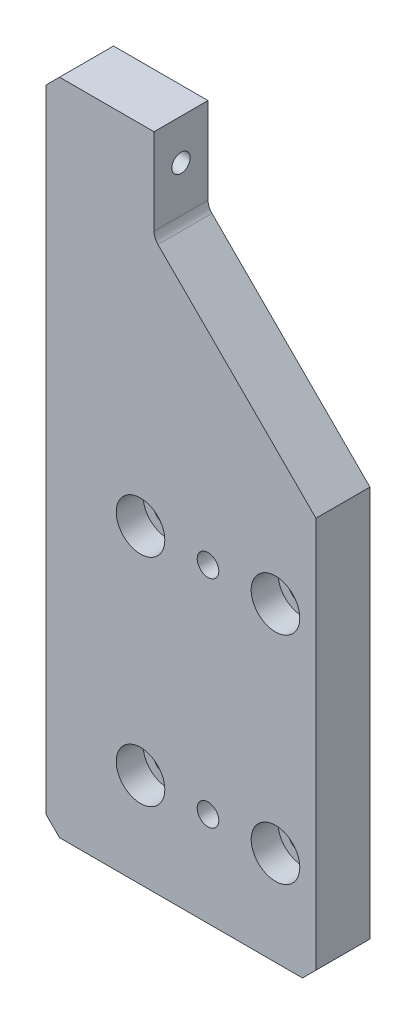
ISO-10303-21;
HEADER;
FILE_DESCRIPTION(('STEP AP214'),'2;1');
FILE_NAME('part.step','',(''),(''),'','','');
FILE_SCHEMA(('AUTOMOTIVE_DESIGN { 1 0 10303 214 1 1 1 1 }'));
ENDSEC;
DATA;
#1=APPLICATION_CONTEXT('core data for automotive mechanical design processes');
#2=APPLICATION_PROTOCOL_DEFINITION('international standard','automotive_design',2000,#1);
#3=PRODUCT_CONTEXT('',#1,'mechanical');
#4=PRODUCT('Part','Part','',(#3));
#5=PRODUCT_RELATED_PRODUCT_CATEGORY('part','',(#4));
#6=PRODUCT_DEFINITION_FORMATION('','',#4);
#7=PRODUCT_DEFINITION_CONTEXT('part definition',#1,'design');
#8=PRODUCT_DEFINITION('design','',#6,#7);
#9=PRODUCT_DEFINITION_SHAPE('','',#8);
#10=(LENGTH_UNIT() NAMED_UNIT(*) SI_UNIT(.MILLI.,.METRE.));
#11=(NAMED_UNIT(*) PLANE_ANGLE_UNIT() SI_UNIT($,.RADIAN.));
#12=(NAMED_UNIT(*) SI_UNIT($,.STERADIAN.) SOLID_ANGLE_UNIT());
#13=UNCERTAINTY_MEASURE_WITH_UNIT(LENGTH_MEASURE(1.E-05),#10,'distance_accuracy_value','');
#14=(GEOMETRIC_REPRESENTATION_CONTEXT(3) GLOBAL_UNCERTAINTY_ASSIGNED_CONTEXT((#13)) GLOBAL_UNIT_ASSIGNED_CONTEXT((#10,
#11,#12)) REPRESENTATION_CONTEXT('',''));
#15=CARTESIAN_POINT('',(0.,0.,0.));
#16=DIRECTION('',(0.,0.,1.));
#17=DIRECTION('',(1.,0.,0.));
#18=AXIS2_PLACEMENT_3D('',#15,#16,#17);
#19=CARTESIAN_POINT('',(50.,0.,20.));
#20=DIRECTION('',(0.,0.,-1.));
#21=DIRECTION('',(-1.,0.,0.));
#22=AXIS2_PLACEMENT_3D('',#19,#20,#21);
#23=PLANE('',#22);
#24=CARTESIAN_POINT('',(10.,-209.,20.));
#25=DIRECTION('',(0.,0.,1.));
#26=DIRECTION('',(1.,0.,0.));
#27=AXIS2_PLACEMENT_3D('',#24,#25,#26);
#28=CIRCLE('',#27,3.99999999999999);
#29=CARTESIAN_POINT('',(14.,-209.,20.));
#30=VERTEX_POINT('',#29);
#31=EDGE_CURVE('E256',#30,#30,#28,.T.);
#32=ORIENTED_EDGE('',*,*,#31,.F.);
#33=EDGE_LOOP('',(#32));
#34=FACE_BOUND('',#33,.T.);
#35=CARTESIAN_POINT('',(35.,-129.,20.));
#36=DIRECTION('',(0.,0.,1.));
#37=DIRECTION('',(1.,0.,0.));
#38=AXIS2_PLACEMENT_3D('',#35,#36,#37);
#39=CIRCLE('',#38,9.);
#40=CARTESIAN_POINT('',(44.,-129.,20.));
#41=VERTEX_POINT('',#40);
#42=EDGE_CURVE('E210',#41,#41,#39,.T.);
#43=ORIENTED_EDGE('',*,*,#42,.F.);
#44=EDGE_LOOP('',(#43));
#45=FACE_BOUND('',#44,.T.);
#46=DIRECTION('',(-1.,0.,0.));
#47=VECTOR('',#46,1.);
#48=CARTESIAN_POINT('',(50.,0.,20.));
#49=LINE('',#48,#47);
#50=CARTESIAN_POINT('',(-9.99999999999999,0.,20.));
#51=VERTEX_POINT('',#50);
#52=CARTESIAN_POINT('',(-44.9999999999999,0.,20.));
#53=VERTEX_POINT('',#52);
#54=EDGE_CURVE('E131',#51,#53,#49,.T.);
#55=ORIENTED_EDGE('',*,*,#54,.T.);
#56=DIRECTION('',(0.707106781186546,0.70710678118655,0.));
#57=VECTOR('',#56,1.);
#58=CARTESIAN_POINT('',(-45.,0.,20.));
#59=LINE('',#58,#57);
#60=CARTESIAN_POINT('',(-50.,-5.00000000000003,20.));
#61=VERTEX_POINT('',#60);
#62=EDGE_CURVE('E172',#53,#61,#59,.F.);
#63=ORIENTED_EDGE('',*,*,#62,.T.);
#64=DIRECTION('',(0.,-1.,0.));
#65=VECTOR('',#64,1.);
#66=CARTESIAN_POINT('',(-50.,0.,20.));
#67=LINE('',#66,#65);
#68=CARTESIAN_POINT('',(-50.,-239.,20.));
#69=VERTEX_POINT('',#68);
#70=EDGE_CURVE('E293',#61,#69,#67,.T.);
#71=ORIENTED_EDGE('',*,*,#70,.T.);
#72=DIRECTION('',(-0.707106781186546,0.70710678118655,0.));
#73=VECTOR('',#72,1.);
#74=CARTESIAN_POINT('',(-45.,-244.,20.));
#75=LINE('',#74,#73);
#76=CARTESIAN_POINT('',(-44.9999999999999,-244.,20.));
#77=VERTEX_POINT('',#76);
#78=EDGE_CURVE('E167',#69,#77,#75,.F.);
#79=ORIENTED_EDGE('',*,*,#78,.T.);
#80=DIRECTION('',(-1.,0.,0.));
#81=VECTOR('',#80,1.);
#82=CARTESIAN_POINT('',(50.,-244.,20.));
#83=LINE('',#82,#81);
#84=CARTESIAN_POINT('',(45.,-244.,20.));
#85=VERTEX_POINT('',#84);
#86=EDGE_CURVE('E145',#85,#77,#83,.T.);
#87=ORIENTED_EDGE('',*,*,#86,.F.);
#88=DIRECTION('',(0.70710678118655,0.707106781186546,0.));
#89=VECTOR('',#88,1.);
#90=CARTESIAN_POINT('',(50.,-239.,20.));
#91=LINE('',#90,#89);
#92=CARTESIAN_POINT('',(50.,-239.,20.));
#93=VERTEX_POINT('',#92);
#94=EDGE_CURVE('E170',#85,#93,#91,.T.);
#95=ORIENTED_EDGE('',*,*,#94,.T.);
#96=DIRECTION('',(0.,-1.,0.));
#97=VECTOR('',#96,1.);
#98=CARTESIAN_POINT('',(50.,0.,20.));
#99=LINE('',#98,#97);
#100=CARTESIAN_POINT('',(50.,-94.0000000000002,20.));
#101=VERTEX_POINT('',#100);
#102=EDGE_CURVE('E246',#101,#93,#99,.T.);
#103=ORIENTED_EDGE('',*,*,#102,.F.);
#104=DIRECTION('',(-0.707106781186546,0.707106781186549,0.));
#105=VECTOR('',#104,1.);
#106=CARTESIAN_POINT('',(-9.99999999999999,-34.,20.));
#107=LINE('',#106,#105);
#108=CARTESIAN_POINT('',(-8.53553390593274,-35.4644660940673,20.));
#109=VERTEX_POINT('',#108);
#110=EDGE_CURVE('E161',#101,#109,#107,.T.);
#111=ORIENTED_EDGE('',*,*,#110,.T.);
#112=CARTESIAN_POINT('',(-4.99999999999999,-31.9289321881345,20.));
#113=DIRECTION('',(0.,0.,-1.));
#114=DIRECTION('',(-1.,0.,0.));
#115=AXIS2_PLACEMENT_3D('',#112,#113,#114);
#116=CIRCLE('',#115,5.);
#117=CARTESIAN_POINT('',(-9.99999999999999,-31.9289321881345,20.));
#118=VERTEX_POINT('',#117);
#119=EDGE_CURVE('E47',#109,#118,#116,.T.);
#120=ORIENTED_EDGE('',*,*,#119,.T.);
#121=DIRECTION('',(0.,1.,0.));
#122=VECTOR('',#121,1.);
#123=CARTESIAN_POINT('',(-9.99999999999999,-34.,20.));
#124=LINE('',#123,#122);
#125=EDGE_CURVE('E122',#118,#51,#124,.T.);
#126=ORIENTED_EDGE('',*,*,#125,.T.);
#127=EDGE_LOOP('',(#55,#63,#71,#79,#87,#95,#103,#111,#120,#126));
#128=FACE_BOUND('',#127,.T.);
#129=CARTESIAN_POINT('',(35.,-209.,20.));
#130=DIRECTION('',(0.,0.,1.));
#131=DIRECTION('',(1.,0.,0.));
#132=AXIS2_PLACEMENT_3D('',#129,#130,#131);
#133=CIRCLE('',#132,9.);
#134=CARTESIAN_POINT('',(44.,-209.,20.));
#135=VERTEX_POINT('',#134);
#136=EDGE_CURVE('E233',#135,#135,#133,.T.);
#137=ORIENTED_EDGE('',*,*,#136,.F.);
#138=EDGE_LOOP('',(#137));
#139=FACE_BOUND('',#138,.T.);
#140=CARTESIAN_POINT('',(-15.,-209.,20.));
#141=DIRECTION('',(0.,0.,1.));
#142=DIRECTION('',(1.,0.,0.));
#143=AXIS2_PLACEMENT_3D('',#140,#141,#142);
#144=CIRCLE('',#143,9.);
#145=CARTESIAN_POINT('',(-6.,-209.,20.));
#146=VERTEX_POINT('',#145);
#147=EDGE_CURVE('E251',#146,#146,#144,.T.);
#148=ORIENTED_EDGE('',*,*,#147,.F.);
#149=EDGE_LOOP('',(#148));
#150=FACE_BOUND('',#149,.T.);
#151=CARTESIAN_POINT('',(-15.,-129.,20.));
#152=DIRECTION('',(0.,0.,1.));
#153=DIRECTION('',(1.,0.,0.));
#154=AXIS2_PLACEMENT_3D('',#151,#152,#153);
#155=CIRCLE('',#154,9.);
#156=CARTESIAN_POINT('',(-6.,-129.,20.));
#157=VERTEX_POINT('',#156);
#158=EDGE_CURVE('E230',#157,#157,#155,.T.);
#159=ORIENTED_EDGE('',*,*,#158,.F.);
#160=EDGE_LOOP('',(#159));
#161=FACE_BOUND('',#160,.T.);
#162=CARTESIAN_POINT('',(10.,-129.,20.));
#163=DIRECTION('',(0.,0.,1.));
#164=DIRECTION('',(1.,0.,0.));
#165=AXIS2_PLACEMENT_3D('',#162,#163,#164);
#166=CIRCLE('',#165,3.99999999999999);
#167=CARTESIAN_POINT('',(14.,-129.,20.));
#168=VERTEX_POINT('',#167);
#169=EDGE_CURVE('E208',#168,#168,#166,.T.);
#170=ORIENTED_EDGE('',*,*,#169,.F.);
#171=EDGE_LOOP('',(#170));
#172=FACE_BOUND('',#171,.T.);
#173=ADVANCED_FACE('F38',(#34,#45,#128,#139,#150,#161,#172),#23,.F.);
#174=CARTESIAN_POINT('',(-10.,-34.,0.));
#175=DIRECTION('',(-1.,0.,0.));
#176=DIRECTION('',(0.,0.,1.));
#177=AXIS2_PLACEMENT_3D('',#174,#175,#176);
#178=PLANE('',#177);
#179=ORIENTED_EDGE('',*,*,#125,.F.);
#180=DIRECTION('',(0.,0.,1.));
#181=VECTOR('',#180,1.);
#182=CARTESIAN_POINT('',(-10.,-31.9289321881345,0.));
#183=LINE('',#182,#181);
#184=CARTESIAN_POINT('',(-10.,-31.9289321881345,0.));
#185=VERTEX_POINT('',#184);
#186=EDGE_CURVE('E54',#118,#185,#183,.F.);
#187=ORIENTED_EDGE('',*,*,#186,.T.);
#188=DIRECTION('',(0.,1.,0.));
#189=VECTOR('',#188,1.);
#190=CARTESIAN_POINT('',(-10.,-34.,0.));
#191=LINE('',#190,#189);
#192=CARTESIAN_POINT('',(-10.,0.,0.));
#193=VERTEX_POINT('',#192);
#194=EDGE_CURVE('E112',#185,#193,#191,.T.);
#195=ORIENTED_EDGE('',*,*,#194,.T.);
#196=DIRECTION('',(0.,0.,1.));
#197=VECTOR('',#196,1.);
#198=CARTESIAN_POINT('',(-10.,0.,0.));
#199=LINE('',#198,#197);
#200=EDGE_CURVE('E116',#193,#51,#199,.T.);
#201=ORIENTED_EDGE('',*,*,#200,.T.);
#202=EDGE_LOOP('',(#179,#187,#195,#201));
#203=FACE_BOUND('',#202,.T.);
#204=CARTESIAN_POINT('',(-10.,-15.,10.));
#205=DIRECTION('',(1.,0.,0.));
#206=DIRECTION('',(0.,0.,-1.));
#207=AXIS2_PLACEMENT_3D('',#204,#205,#206);
#208=CIRCLE('',#207,3.39999999999999);
#209=CARTESIAN_POINT('',(-10.,-15.,6.60000000000002));
#210=VERTEX_POINT('',#209);
#211=EDGE_CURVE('E222',#210,#210,#208,.T.);
#212=ORIENTED_EDGE('',*,*,#211,.F.);
#213=EDGE_LOOP('',(#212));
#214=FACE_BOUND('',#213,.T.);
#215=ADVANCED_FACE('F114',(#203,#214),#178,.F.);
#216=CARTESIAN_POINT('',(50.,-244.,20.));
#217=DIRECTION('',(0.,1.,0.));
#218=DIRECTION('',(0.,0.,1.));
#219=AXIS2_PLACEMENT_3D('',#216,#217,#218);
#220=PLANE('',#219);
#221=DIRECTION('',(-1.,0.,0.));
#222=VECTOR('',#221,1.);
#223=CARTESIAN_POINT('',(50.,-244.,0.));
#224=LINE('',#223,#222);
#225=CARTESIAN_POINT('',(45.,-244.,0.));
#226=VERTEX_POINT('',#225);
#227=CARTESIAN_POINT('',(-44.9999999999999,-244.,0.));
#228=VERTEX_POINT('',#227);
#229=EDGE_CURVE('E140',#226,#228,#224,.T.);
#230=ORIENTED_EDGE('',*,*,#229,.F.);
#231=DIRECTION('',(0.,0.,1.));
#232=VECTOR('',#231,1.);
#233=CARTESIAN_POINT('',(45.,-244.,20.));
#234=LINE('',#233,#232);
#235=EDGE_CURVE('E197',#226,#85,#234,.T.);
#236=ORIENTED_EDGE('',*,*,#235,.T.);
#237=ORIENTED_EDGE('',*,*,#86,.T.);
#238=DIRECTION('',(0.,0.,-1.));
#239=VECTOR('',#238,1.);
#240=CARTESIAN_POINT('',(-45.,-244.,20.));
#241=LINE('',#240,#239);
#242=EDGE_CURVE('E193',#77,#228,#241,.T.);
#243=ORIENTED_EDGE('',*,*,#242,.T.);
#244=EDGE_LOOP('',(#230,#236,#237,#243));
#245=FACE_BOUND('',#244,.T.);
#246=ADVANCED_FACE('F320',(#245),#220,.F.);
#247=CARTESIAN_POINT('',(50.,-244.,0.));
#248=DIRECTION('',(0.,0.,1.));
#249=DIRECTION('',(0.,-1.,0.));
#250=AXIS2_PLACEMENT_3D('',#247,#248,#249);
#251=PLANE('',#250);
#252=CARTESIAN_POINT('',(10.,-129.,0.));
#253=DIRECTION('',(0.,0.,1.));
#254=DIRECTION('',(0.,-1.,0.));
#255=AXIS2_PLACEMENT_3D('',#252,#253,#254);
#256=CIRCLE('',#255,3.99999999999999);
#257=CARTESIAN_POINT('',(10.,-133.,0.));
#258=VERTEX_POINT('',#257);
#259=EDGE_CURVE('E289',#258,#258,#256,.T.);
#260=ORIENTED_EDGE('',*,*,#259,.T.);
#261=EDGE_LOOP('',(#260));
#262=FACE_BOUND('',#261,.T.);
#263=CARTESIAN_POINT('',(10.,-209.,0.));
#264=DIRECTION('',(0.,0.,1.));
#265=DIRECTION('',(0.,-1.,0.));
#266=AXIS2_PLACEMENT_3D('',#263,#264,#265);
#267=CIRCLE('',#266,3.99999999999999);
#268=CARTESIAN_POINT('',(10.,-213.,0.));
#269=VERTEX_POINT('',#268);
#270=EDGE_CURVE('E243',#269,#269,#267,.T.);
#271=ORIENTED_EDGE('',*,*,#270,.T.);
#272=EDGE_LOOP('',(#271));
#273=FACE_BOUND('',#272,.T.);
#274=CARTESIAN_POINT('',(-15.,-129.,0.));
#275=DIRECTION('',(0.,0.,1.));
#276=DIRECTION('',(0.,-1.,0.));
#277=AXIS2_PLACEMENT_3D('',#274,#275,#276);
#278=CIRCLE('',#277,5.5);
#279=CARTESIAN_POINT('',(-15.,-134.5,0.));
#280=VERTEX_POINT('',#279);
#281=EDGE_CURVE('E218',#280,#280,#278,.T.);
#282=ORIENTED_EDGE('',*,*,#281,.T.);
#283=EDGE_LOOP('',(#282));
#284=FACE_BOUND('',#283,.T.);
#285=CARTESIAN_POINT('',(35.,-129.,0.));
#286=DIRECTION('',(0.,0.,1.));
#287=DIRECTION('',(0.,-1.,0.));
#288=AXIS2_PLACEMENT_3D('',#285,#286,#287);
#289=CIRCLE('',#288,5.5);
#290=CARTESIAN_POINT('',(35.,-134.5,0.));
#291=VERTEX_POINT('',#290);
#292=EDGE_CURVE('E213',#291,#291,#289,.T.);
#293=ORIENTED_EDGE('',*,*,#292,.T.);
#294=EDGE_LOOP('',(#293));
#295=FACE_BOUND('',#294,.T.);
#296=CARTESIAN_POINT('',(-15.,-209.,0.));
#297=DIRECTION('',(0.,0.,1.));
#298=DIRECTION('',(0.,-1.,0.));
#299=AXIS2_PLACEMENT_3D('',#296,#297,#298);
#300=CIRCLE('',#299,5.5);
#301=CARTESIAN_POINT('',(-15.,-214.5,0.));
#302=VERTEX_POINT('',#301);
#303=EDGE_CURVE('E262',#302,#302,#300,.T.);
#304=ORIENTED_EDGE('',*,*,#303,.T.);
#305=EDGE_LOOP('',(#304));
#306=FACE_BOUND('',#305,.T.);
#307=CARTESIAN_POINT('',(35.,-209.,0.));
#308=DIRECTION('',(0.,0.,1.));
#309=DIRECTION('',(0.,-1.,0.));
#310=AXIS2_PLACEMENT_3D('',#307,#308,#309);
#311=CIRCLE('',#310,5.5);
#312=CARTESIAN_POINT('',(35.,-214.5,0.));
#313=VERTEX_POINT('',#312);
#314=EDGE_CURVE('E236',#313,#313,#311,.T.);
#315=ORIENTED_EDGE('',*,*,#314,.T.);
#316=EDGE_LOOP('',(#315));
#317=FACE_BOUND('',#316,.T.);
#318=DIRECTION('',(0.,1.,0.));
#319=VECTOR('',#318,1.);
#320=CARTESIAN_POINT('',(-50.,-244.,0.));
#321=LINE('',#320,#319);
#322=CARTESIAN_POINT('',(-50.,-239.,0.));
#323=VERTEX_POINT('',#322);
#324=CARTESIAN_POINT('',(-50.,-5.0000000000001,0.));
#325=VERTEX_POINT('',#324);
#326=EDGE_CURVE('E260',#323,#325,#321,.T.);
#327=ORIENTED_EDGE('',*,*,#326,.T.);
#328=DIRECTION('',(-0.707106781186546,-0.70710678118655,0.));
#329=VECTOR('',#328,1.);
#330=CARTESIAN_POINT('',(-45.,0.,0.));
#331=LINE('',#330,#329);
#332=CARTESIAN_POINT('',(-44.9999999999999,0.,0.));
#333=VERTEX_POINT('',#332);
#334=EDGE_CURVE('E138',#325,#333,#331,.F.);
#335=ORIENTED_EDGE('',*,*,#334,.T.);
#336=DIRECTION('',(-1.,0.,0.));
#337=VECTOR('',#336,1.);
#338=CARTESIAN_POINT('',(50.,0.,0.));
#339=LINE('',#338,#337);
#340=EDGE_CURVE('E128',#193,#333,#339,.T.);
#341=ORIENTED_EDGE('',*,*,#340,.F.);
#342=ORIENTED_EDGE('',*,*,#194,.F.);
#343=CARTESIAN_POINT('',(-5.,-31.9289321881345,0.));
#344=DIRECTION('',(0.,0.,1.));
#345=DIRECTION('',(0.,-1.,0.));
#346=AXIS2_PLACEMENT_3D('',#343,#344,#345);
#347=CIRCLE('',#346,5.);
#348=CARTESIAN_POINT('',(-8.53553390593275,-35.4644660940673,0.));
#349=VERTEX_POINT('',#348);
#350=EDGE_CURVE('E11',#185,#349,#347,.T.);
#351=ORIENTED_EDGE('',*,*,#350,.T.);
#352=DIRECTION('',(0.707106781186546,-0.707106781186549,0.));
#353=VECTOR('',#352,1.);
#354=CARTESIAN_POINT('',(-9.99999999999999,-34.,0.));
#355=LINE('',#354,#353);
#356=CARTESIAN_POINT('',(50.,-94.0000000000003,0.));
#357=VERTEX_POINT('',#356);
#358=EDGE_CURVE('E155',#349,#357,#355,.T.);
#359=ORIENTED_EDGE('',*,*,#358,.T.);
#360=DIRECTION('',(0.,1.,0.));
#361=VECTOR('',#360,1.);
#362=CARTESIAN_POINT('',(50.,-244.,0.));
#363=LINE('',#362,#361);
#364=CARTESIAN_POINT('',(50.,-239.,0.));
#365=VERTEX_POINT('',#364);
#366=EDGE_CURVE('E148',#365,#357,#363,.T.);
#367=ORIENTED_EDGE('',*,*,#366,.F.);
#368=DIRECTION('',(-0.70710678118655,-0.707106781186546,0.));
#369=VECTOR('',#368,1.);
#370=CARTESIAN_POINT('',(50.,-239.,0.));
#371=LINE('',#370,#369);
#372=EDGE_CURVE('E184',#365,#226,#371,.T.);
#373=ORIENTED_EDGE('',*,*,#372,.T.);
#374=ORIENTED_EDGE('',*,*,#229,.T.);
#375=DIRECTION('',(0.707106781186546,-0.70710678118655,0.));
#376=VECTOR('',#375,1.);
#377=CARTESIAN_POINT('',(-45.,-244.,0.));
#378=LINE('',#377,#376);
#379=EDGE_CURVE('E181',#228,#323,#378,.F.);
#380=ORIENTED_EDGE('',*,*,#379,.T.);
#381=EDGE_LOOP('',(#327,#335,#341,#342,#351,#359,#367,#373,#374,#380));
#382=FACE_BOUND('',#381,.T.);
#383=ADVANCED_FACE('F136',(#262,#273,#284,#295,#306,#317,#382),#251,.F.);
#384=CARTESIAN_POINT('',(50.,0.,20.));
#385=DIRECTION('',(0.,-1.,0.));
#386=DIRECTION('',(0.,0.,-1.));
#387=AXIS2_PLACEMENT_3D('',#384,#385,#386);
#388=PLANE('',#387);
#389=ORIENTED_EDGE('',*,*,#340,.T.);
#390=DIRECTION('',(0.,0.,1.));
#391=VECTOR('',#390,1.);
#392=CARTESIAN_POINT('',(-45.,0.,20.));
#393=LINE('',#392,#391);
#394=EDGE_CURVE('E164',#333,#53,#393,.T.);
#395=ORIENTED_EDGE('',*,*,#394,.T.);
#396=ORIENTED_EDGE('',*,*,#54,.F.);
#397=ORIENTED_EDGE('',*,*,#200,.F.);
#398=EDGE_LOOP('',(#389,#395,#396,#397));
#399=FACE_BOUND('',#398,.T.);
#400=ADVANCED_FACE('F126',(#399),#388,.F.);
#401=CARTESIAN_POINT('',(50.,-244.,20.));
#402=DIRECTION('',(1.,0.,0.));
#403=DIRECTION('',(0.,0.,-1.));
#404=AXIS2_PLACEMENT_3D('',#401,#402,#403);
#405=PLANE('',#404);
#406=ORIENTED_EDGE('',*,*,#102,.T.);
#407=DIRECTION('',(0.,0.,-1.));
#408=VECTOR('',#407,1.);
#409=CARTESIAN_POINT('',(50.,-239.,0.));
#410=LINE('',#409,#408);
#411=EDGE_CURVE('E189',#93,#365,#410,.T.);
#412=ORIENTED_EDGE('',*,*,#411,.T.);
#413=ORIENTED_EDGE('',*,*,#366,.T.);
#414=DIRECTION('',(0.,0.,1.));
#415=VECTOR('',#414,1.);
#416=CARTESIAN_POINT('',(50.,-94.0000000000002,20.));
#417=LINE('',#416,#415);
#418=EDGE_CURVE('E158',#357,#101,#417,.T.);
#419=ORIENTED_EDGE('',*,*,#418,.T.);
#420=EDGE_LOOP('',(#406,#412,#413,#419));
#421=FACE_BOUND('',#420,.T.);
#422=ADVANCED_FACE('F363',(#421),#405,.T.);
#423=CARTESIAN_POINT('',(-50.,-244.,20.));
#424=DIRECTION('',(1.,0.,0.));
#425=DIRECTION('',(0.,0.,-1.));
#426=AXIS2_PLACEMENT_3D('',#423,#424,#425);
#427=PLANE('',#426);
#428=CARTESIAN_POINT('',(-50.,-15.,10.));
#429=DIRECTION('',(1.,0.,0.));
#430=DIRECTION('',(0.,0.,-1.));
#431=AXIS2_PLACEMENT_3D('',#428,#429,#430);
#432=CIRCLE('',#431,3.39999999999999);
#433=CARTESIAN_POINT('',(-50.,-15.,6.60000000000003));
#434=VERTEX_POINT('',#433);
#435=EDGE_CURVE('E133',#434,#434,#432,.T.);
#436=ORIENTED_EDGE('',*,*,#435,.T.);
#437=EDGE_LOOP('',(#436));
#438=FACE_BOUND('',#437,.T.);
#439=ORIENTED_EDGE('',*,*,#70,.F.);
#440=DIRECTION('',(0.,0.,-1.));
#441=VECTOR('',#440,1.);
#442=CARTESIAN_POINT('',(-50.,-5.00000000000003,20.));
#443=LINE('',#442,#441);
#444=EDGE_CURVE('E178',#61,#325,#443,.T.);
#445=ORIENTED_EDGE('',*,*,#444,.T.);
#446=ORIENTED_EDGE('',*,*,#326,.F.);
#447=DIRECTION('',(0.,0.,1.));
#448=VECTOR('',#447,1.);
#449=CARTESIAN_POINT('',(-50.,-239.,20.));
#450=LINE('',#449,#448);
#451=EDGE_CURVE('E175',#323,#69,#450,.T.);
#452=ORIENTED_EDGE('',*,*,#451,.T.);
#453=EDGE_LOOP('',(#439,#445,#446,#452));
#454=FACE_BOUND('',#453,.T.);
#455=ADVANCED_FACE('F371',(#438,#454),#427,.F.);
#456=CARTESIAN_POINT('',(-10.,-15.,10.));
#457=DIRECTION('',(1.,0.,0.));
#458=DIRECTION('',(0.,0.,-1.));
#459=AXIS2_PLACEMENT_3D('',#456,#457,#458);
#460=CYLINDRICAL_SURFACE('',#459,3.39999999999999);
#461=ORIENTED_EDGE('',*,*,#435,.F.);
#462=EDGE_LOOP('',(#461));
#463=FACE_BOUND('',#462,.T.);
#464=ORIENTED_EDGE('',*,*,#211,.T.);
#465=EDGE_LOOP('',(#464));
#466=FACE_BOUND('',#465,.T.);
#467=ADVANCED_FACE('F331',(#463,#466),#460,.F.);
#468=CARTESIAN_POINT('',(-9.99999999999999,-34.,20.));
#469=DIRECTION('',(0.707106781186549,0.707106781186546,0.));
#470=DIRECTION('',(-0.707106781186546,0.707106781186549,0.));
#471=AXIS2_PLACEMENT_3D('',#468,#469,#470);
#472=PLANE('',#471);
#473=ORIENTED_EDGE('',*,*,#358,.F.);
#474=DIRECTION('',(0.,0.,1.));
#475=VECTOR('',#474,1.);
#476=CARTESIAN_POINT('',(-8.53553390593274,-35.4644660940673,20.));
#477=LINE('',#476,#475);
#478=EDGE_CURVE('E200',#349,#109,#477,.T.);
#479=ORIENTED_EDGE('',*,*,#478,.T.);
#480=ORIENTED_EDGE('',*,*,#110,.F.);
#481=ORIENTED_EDGE('',*,*,#418,.F.);
#482=EDGE_LOOP('',(#473,#479,#480,#481));
#483=FACE_BOUND('',#482,.T.);
#484=ADVANCED_FACE('F327',(#483),#472,.T.);
#485=CARTESIAN_POINT('',(-45.,0.,20.));
#486=DIRECTION('',(0.707106781186549,-0.707106781186545,0.));
#487=DIRECTION('',(0.707106781186546,0.707106781186549,0.));
#488=AXIS2_PLACEMENT_3D('',#485,#486,#487);
#489=PLANE('',#488);
#490=ORIENTED_EDGE('',*,*,#334,.F.);
#491=ORIENTED_EDGE('',*,*,#444,.F.);
#492=ORIENTED_EDGE('',*,*,#62,.F.);
#493=ORIENTED_EDGE('',*,*,#394,.F.);
#494=EDGE_LOOP('',(#490,#491,#492,#493));
#495=FACE_BOUND('',#494,.T.);
#496=ADVANCED_FACE('F330',(#495),#489,.F.);
#497=CARTESIAN_POINT('',(50.,-239.,20.));
#498=DIRECTION('',(0.707106781186545,-0.707106781186549,0.));
#499=DIRECTION('',(0.707106781186549,0.707106781186546,0.));
#500=AXIS2_PLACEMENT_3D('',#497,#498,#499);
#501=PLANE('',#500);
#502=ORIENTED_EDGE('',*,*,#94,.F.);
#503=ORIENTED_EDGE('',*,*,#235,.F.);
#504=ORIENTED_EDGE('',*,*,#372,.F.);
#505=ORIENTED_EDGE('',*,*,#411,.F.);
#506=EDGE_LOOP('',(#502,#503,#504,#505));
#507=FACE_BOUND('',#506,.T.);
#508=ADVANCED_FACE('F335',(#507),#501,.T.);
#509=CARTESIAN_POINT('',(-45.,-244.,20.));
#510=DIRECTION('',(0.707106781186549,0.707106781186545,0.));
#511=DIRECTION('',(-0.707106781186546,0.707106781186549,0.));
#512=AXIS2_PLACEMENT_3D('',#509,#510,#511);
#513=PLANE('',#512);
#514=ORIENTED_EDGE('',*,*,#78,.F.);
#515=ORIENTED_EDGE('',*,*,#451,.F.);
#516=ORIENTED_EDGE('',*,*,#379,.F.);
#517=ORIENTED_EDGE('',*,*,#242,.F.);
#518=EDGE_LOOP('',(#514,#515,#516,#517));
#519=FACE_BOUND('',#518,.T.);
#520=ADVANCED_FACE('F338',(#519),#513,.F.);
#521=CARTESIAN_POINT('',(35.,-209.,20.));
#522=DIRECTION('',(0.,0.,1.));
#523=DIRECTION('',(1.,0.,0.));
#524=AXIS2_PLACEMENT_3D('',#521,#522,#523);
#525=CYLINDRICAL_SURFACE('',#524,9.);
#526=CARTESIAN_POINT('',(35.,-209.,10.));
#527=DIRECTION('',(0.,0.,1.));
#528=DIRECTION('',(1.,0.,0.));
#529=AXIS2_PLACEMENT_3D('',#526,#527,#528);
#530=CIRCLE('',#529,9.);
#531=CARTESIAN_POINT('',(44.,-209.,10.));
#532=VERTEX_POINT('',#531);
#533=EDGE_CURVE('E237',#532,#532,#530,.T.);
#534=ORIENTED_EDGE('',*,*,#533,.F.);
#535=EDGE_LOOP('',(#534));
#536=FACE_BOUND('',#535,.T.);
#537=ORIENTED_EDGE('',*,*,#136,.T.);
#538=EDGE_LOOP('',(#537));
#539=FACE_BOUND('',#538,.T.);
#540=ADVANCED_FACE('F341',(#536,#539),#525,.F.);
#541=CARTESIAN_POINT('',(40.5,-209.,10.));
#542=DIRECTION('',(0.,0.,-1.));
#543=DIRECTION('',(-1.,0.,0.));
#544=AXIS2_PLACEMENT_3D('',#541,#542,#543);
#545=PLANE('',#544);
#546=CARTESIAN_POINT('',(35.,-209.,10.));
#547=DIRECTION('',(0.,0.,1.));
#548=DIRECTION('',(1.,0.,0.));
#549=AXIS2_PLACEMENT_3D('',#546,#547,#548);
#550=CIRCLE('',#549,5.50000000000001);
#551=CARTESIAN_POINT('',(40.5,-209.,10.));
#552=VERTEX_POINT('',#551);
#553=EDGE_CURVE('E264',#552,#552,#550,.T.);
#554=ORIENTED_EDGE('',*,*,#553,.F.);
#555=EDGE_LOOP('',(#554));
#556=FACE_BOUND('',#555,.T.);
#557=ORIENTED_EDGE('',*,*,#533,.T.);
#558=EDGE_LOOP('',(#557));
#559=FACE_BOUND('',#558,.T.);
#560=ADVANCED_FACE('F346',(#556,#559),#545,.F.);
#561=CARTESIAN_POINT('',(35.,-209.,20.));
#562=DIRECTION('',(0.,0.,1.));
#563=DIRECTION('',(1.,0.,0.));
#564=AXIS2_PLACEMENT_3D('',#561,#562,#563);
#565=CYLINDRICAL_SURFACE('',#564,5.5);
#566=ORIENTED_EDGE('',*,*,#314,.F.);
#567=EDGE_LOOP('',(#566));
#568=FACE_BOUND('',#567,.T.);
#569=ORIENTED_EDGE('',*,*,#553,.T.);
#570=EDGE_LOOP('',(#569));
#571=FACE_BOUND('',#570,.T.);
#572=ADVANCED_FACE('F402',(#568,#571),#565,.F.);
#573=CARTESIAN_POINT('',(-15.,-209.,20.));
#574=DIRECTION('',(0.,0.,1.));
#575=DIRECTION('',(1.,0.,0.));
#576=AXIS2_PLACEMENT_3D('',#573,#574,#575);
#577=CYLINDRICAL_SURFACE('',#576,9.);
#578=CARTESIAN_POINT('',(-15.,-209.,10.));
#579=DIRECTION('',(0.,0.,1.));
#580=DIRECTION('',(1.,0.,0.));
#581=AXIS2_PLACEMENT_3D('',#578,#579,#580);
#582=CIRCLE('',#581,9.);
#583=CARTESIAN_POINT('',(-6.,-209.,10.));
#584=VERTEX_POINT('',#583);
#585=EDGE_CURVE('E249',#584,#584,#582,.T.);
#586=ORIENTED_EDGE('',*,*,#585,.F.);
#587=EDGE_LOOP('',(#586));
#588=FACE_BOUND('',#587,.T.);
#589=ORIENTED_EDGE('',*,*,#147,.T.);
#590=EDGE_LOOP('',(#589));
#591=FACE_BOUND('',#590,.T.);
#592=ADVANCED_FACE('F404',(#588,#591),#577,.F.);
#593=CARTESIAN_POINT('',(-9.5,-209.,10.));
#594=DIRECTION('',(0.,0.,-1.));
#595=DIRECTION('',(-1.,0.,0.));
#596=AXIS2_PLACEMENT_3D('',#593,#594,#595);
#597=PLANE('',#596);
#598=CARTESIAN_POINT('',(-15.,-209.,10.));
#599=DIRECTION('',(0.,0.,1.));
#600=DIRECTION('',(1.,0.,0.));
#601=AXIS2_PLACEMENT_3D('',#598,#599,#600);
#602=CIRCLE('',#601,5.5);
#603=CARTESIAN_POINT('',(-9.5,-209.,10.));
#604=VERTEX_POINT('',#603);
#605=EDGE_CURVE('E227',#604,#604,#602,.T.);
#606=ORIENTED_EDGE('',*,*,#605,.F.);
#607=EDGE_LOOP('',(#606));
#608=FACE_BOUND('',#607,.T.);
#609=ORIENTED_EDGE('',*,*,#585,.T.);
#610=EDGE_LOOP('',(#609));
#611=FACE_BOUND('',#610,.T.);
#612=ADVANCED_FACE('F410',(#608,#611),#597,.F.);
#613=CARTESIAN_POINT('',(-15.,-209.,20.));
#614=DIRECTION('',(0.,0.,1.));
#615=DIRECTION('',(1.,0.,0.));
#616=AXIS2_PLACEMENT_3D('',#613,#614,#615);
#617=CYLINDRICAL_SURFACE('',#616,5.5);
#618=ORIENTED_EDGE('',*,*,#303,.F.);
#619=EDGE_LOOP('',(#618));
#620=FACE_BOUND('',#619,.T.);
#621=ORIENTED_EDGE('',*,*,#605,.T.);
#622=EDGE_LOOP('',(#621));
#623=FACE_BOUND('',#622,.T.);
#624=ADVANCED_FACE('F418',(#620,#623),#617,.F.);
#625=CARTESIAN_POINT('',(35.,-129.,20.));
#626=DIRECTION('',(0.,0.,1.));
#627=DIRECTION('',(1.,0.,0.));
#628=AXIS2_PLACEMENT_3D('',#625,#626,#627);
#629=CYLINDRICAL_SURFACE('',#628,9.);
#630=CARTESIAN_POINT('',(35.,-129.,10.));
#631=DIRECTION('',(0.,0.,1.));
#632=DIRECTION('',(1.,0.,0.));
#633=AXIS2_PLACEMENT_3D('',#630,#631,#632);
#634=CIRCLE('',#633,9.);
#635=CARTESIAN_POINT('',(44.,-129.,10.));
#636=VERTEX_POINT('',#635);
#637=EDGE_CURVE('E214',#636,#636,#634,.T.);
#638=ORIENTED_EDGE('',*,*,#637,.F.);
#639=EDGE_LOOP('',(#638));
#640=FACE_BOUND('',#639,.T.);
#641=ORIENTED_EDGE('',*,*,#42,.T.);
#642=EDGE_LOOP('',(#641));
#643=FACE_BOUND('',#642,.T.);
#644=ADVANCED_FACE('F422',(#640,#643),#629,.F.);
#645=CARTESIAN_POINT('',(40.5,-129.,10.));
#646=DIRECTION('',(0.,0.,-1.));
#647=DIRECTION('',(-1.,0.,0.));
#648=AXIS2_PLACEMENT_3D('',#645,#646,#647);
#649=PLANE('',#648);
#650=CARTESIAN_POINT('',(35.,-129.,10.));
#651=DIRECTION('',(0.,0.,1.));
#652=DIRECTION('',(1.,0.,0.));
#653=AXIS2_PLACEMENT_3D('',#650,#651,#652);
#654=CIRCLE('',#653,5.50000000000001);
#655=CARTESIAN_POINT('',(40.5,-129.,10.));
#656=VERTEX_POINT('',#655);
#657=EDGE_CURVE('E216',#656,#656,#654,.T.);
#658=ORIENTED_EDGE('',*,*,#657,.F.);
#659=EDGE_LOOP('',(#658));
#660=FACE_BOUND('',#659,.T.);
#661=ORIENTED_EDGE('',*,*,#637,.T.);
#662=EDGE_LOOP('',(#661));
#663=FACE_BOUND('',#662,.T.);
#664=ADVANCED_FACE('F426',(#660,#663),#649,.F.);
#665=CARTESIAN_POINT('',(35.,-129.,20.));
#666=DIRECTION('',(0.,0.,1.));
#667=DIRECTION('',(1.,0.,0.));
#668=AXIS2_PLACEMENT_3D('',#665,#666,#667);
#669=CYLINDRICAL_SURFACE('',#668,5.5);
#670=ORIENTED_EDGE('',*,*,#292,.F.);
#671=EDGE_LOOP('',(#670));
#672=FACE_BOUND('',#671,.T.);
#673=ORIENTED_EDGE('',*,*,#657,.T.);
#674=EDGE_LOOP('',(#673));
#675=FACE_BOUND('',#674,.T.);
#676=ADVANCED_FACE('F430',(#672,#675),#669,.F.);
#677=CARTESIAN_POINT('',(-15.,-129.,20.));
#678=DIRECTION('',(0.,0.,1.));
#679=DIRECTION('',(1.,0.,0.));
#680=AXIS2_PLACEMENT_3D('',#677,#678,#679);
#681=CYLINDRICAL_SURFACE('',#680,9.);
#682=CARTESIAN_POINT('',(-15.,-129.,10.));
#683=DIRECTION('',(0.,0.,1.));
#684=DIRECTION('',(1.,0.,0.));
#685=AXIS2_PLACEMENT_3D('',#682,#683,#684);
#686=CIRCLE('',#685,9.);
#687=CARTESIAN_POINT('',(-6.,-129.,10.));
#688=VERTEX_POINT('',#687);
#689=EDGE_CURVE('E242',#688,#688,#686,.T.);
#690=ORIENTED_EDGE('',*,*,#689,.F.);
#691=EDGE_LOOP('',(#690));
#692=FACE_BOUND('',#691,.T.);
#693=ORIENTED_EDGE('',*,*,#158,.T.);
#694=EDGE_LOOP('',(#693));
#695=FACE_BOUND('',#694,.T.);
#696=ADVANCED_FACE('F434',(#692,#695),#681,.F.);
#697=CARTESIAN_POINT('',(-9.5,-129.,10.));
#698=DIRECTION('',(0.,0.,-1.));
#699=DIRECTION('',(-1.,0.,0.));
#700=AXIS2_PLACEMENT_3D('',#697,#698,#699);
#701=PLANE('',#700);
#702=CARTESIAN_POINT('',(-15.,-129.,10.));
#703=DIRECTION('',(0.,0.,1.));
#704=DIRECTION('',(1.,0.,0.));
#705=AXIS2_PLACEMENT_3D('',#702,#703,#704);
#706=CIRCLE('',#705,5.5);
#707=CARTESIAN_POINT('',(-9.5,-129.,10.));
#708=VERTEX_POINT('',#707);
#709=EDGE_CURVE('E239',#708,#708,#706,.T.);
#710=ORIENTED_EDGE('',*,*,#709,.F.);
#711=EDGE_LOOP('',(#710));
#712=FACE_BOUND('',#711,.T.);
#713=ORIENTED_EDGE('',*,*,#689,.T.);
#714=EDGE_LOOP('',(#713));
#715=FACE_BOUND('',#714,.T.);
#716=ADVANCED_FACE('F438',(#712,#715),#701,.F.);
#717=CARTESIAN_POINT('',(-15.,-129.,20.));
#718=DIRECTION('',(0.,0.,1.));
#719=DIRECTION('',(1.,0.,0.));
#720=AXIS2_PLACEMENT_3D('',#717,#718,#719);
#721=CYLINDRICAL_SURFACE('',#720,5.5);
#722=ORIENTED_EDGE('',*,*,#281,.F.);
#723=EDGE_LOOP('',(#722));
#724=FACE_BOUND('',#723,.T.);
#725=ORIENTED_EDGE('',*,*,#709,.T.);
#726=EDGE_LOOP('',(#725));
#727=FACE_BOUND('',#726,.T.);
#728=ADVANCED_FACE('F442',(#724,#727),#721,.F.);
#729=CARTESIAN_POINT('',(10.,-209.,20.));
#730=DIRECTION('',(0.,0.,1.));
#731=DIRECTION('',(1.,0.,0.));
#732=AXIS2_PLACEMENT_3D('',#729,#730,#731);
#733=CYLINDRICAL_SURFACE('',#732,3.99999999999999);
#734=ORIENTED_EDGE('',*,*,#270,.F.);
#735=EDGE_LOOP('',(#734));
#736=FACE_BOUND('',#735,.T.);
#737=ORIENTED_EDGE('',*,*,#31,.T.);
#738=EDGE_LOOP('',(#737));
#739=FACE_BOUND('',#738,.T.);
#740=ADVANCED_FACE('F446',(#736,#739),#733,.F.);
#741=CARTESIAN_POINT('',(10.,-129.,20.));
#742=DIRECTION('',(0.,0.,1.));
#743=DIRECTION('',(1.,0.,0.));
#744=AXIS2_PLACEMENT_3D('',#741,#742,#743);
#745=CYLINDRICAL_SURFACE('',#744,3.99999999999999);
#746=ORIENTED_EDGE('',*,*,#259,.F.);
#747=EDGE_LOOP('',(#746));
#748=FACE_BOUND('',#747,.T.);
#749=ORIENTED_EDGE('',*,*,#169,.T.);
#750=EDGE_LOOP('',(#749));
#751=FACE_BOUND('',#750,.T.);
#752=ADVANCED_FACE('F312',(#748,#751),#745,.F.);
#753=CARTESIAN_POINT('',(-4.99999999999999,-31.9289321881345,20.));
#754=DIRECTION('',(0.,0.,1.));
#755=DIRECTION('',(0.,-1.,0.));
#756=AXIS2_PLACEMENT_3D('',#753,#754,#755);
#757=CYLINDRICAL_SURFACE('',#756,5.);
#758=ORIENTED_EDGE('',*,*,#350,.F.);
#759=ORIENTED_EDGE('',*,*,#186,.F.);
#760=ORIENTED_EDGE('',*,*,#119,.F.);
#761=ORIENTED_EDGE('',*,*,#478,.F.);
#762=EDGE_LOOP('',(#758,#759,#760,#761));
#763=FACE_BOUND('',#762,.T.);
#764=ADVANCED_FACE('F40',(#763),#757,.F.);
#765=CLOSED_SHELL('',(#173,#215,#246,#383,#400,#422,#455,#467,#484,#496,#508,#520,#540,#560,
#572,#592,#612,#624,#644,#664,#676,#696,#716,#728,#740,#752,#764));
#766=MANIFOLD_SOLID_BREP('B2',#765);
#767=ADVANCED_BREP_SHAPE_REPRESENTATION('',(#18,#766),#14);
#768=SHAPE_DEFINITION_REPRESENTATION(#9,#767);
ENDSEC;
END-ISO-10303-21;
